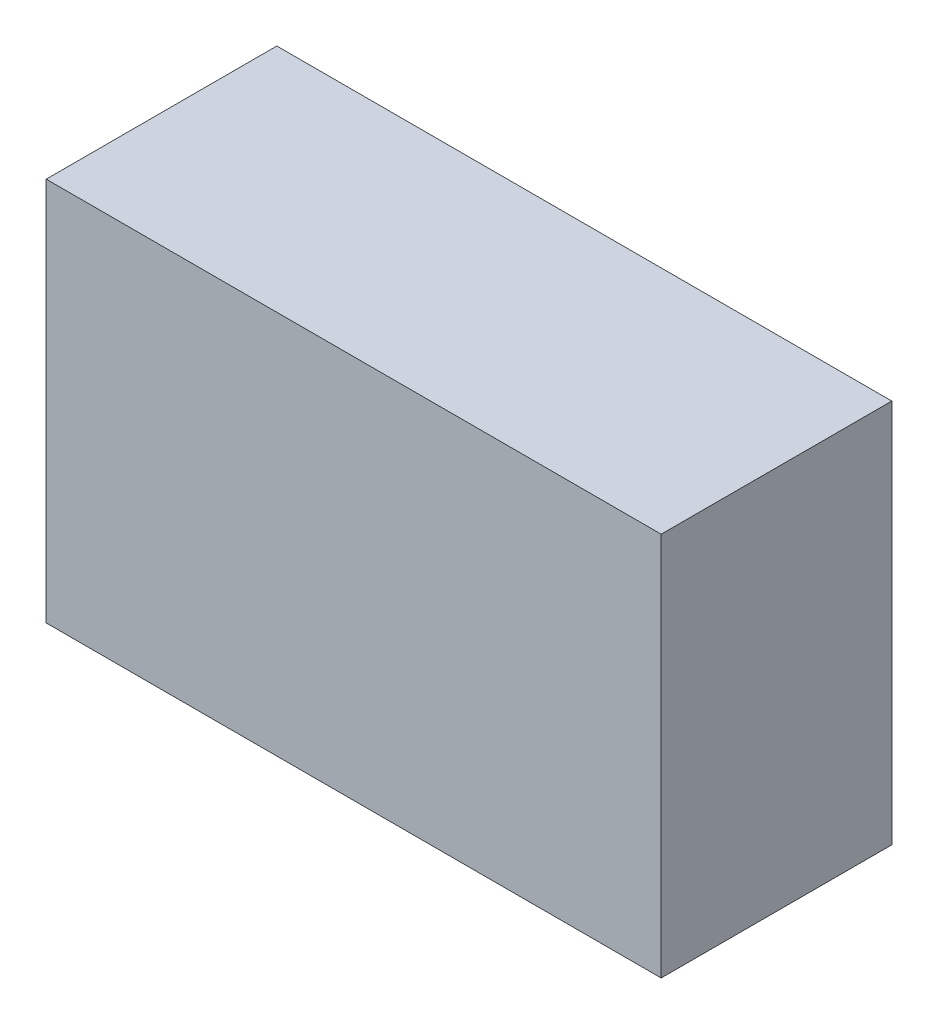
ISO-10303-21;
HEADER;
FILE_DESCRIPTION(('STEP AP214'),'2;1');
FILE_NAME('part.step','',(''),(''),'','','');
FILE_SCHEMA(('AUTOMOTIVE_DESIGN { 1 0 10303 214 1 1 1 1 }'));
ENDSEC;
DATA;
#1=APPLICATION_CONTEXT('core data for automotive mechanical design processes');
#2=APPLICATION_PROTOCOL_DEFINITION('international standard','automotive_design',2000,#1);
#3=PRODUCT_CONTEXT('',#1,'mechanical');
#4=PRODUCT('Part','Part','',(#3));
#5=PRODUCT_RELATED_PRODUCT_CATEGORY('part','',(#4));
#6=PRODUCT_DEFINITION_FORMATION('','',#4);
#7=PRODUCT_DEFINITION_CONTEXT('part definition',#1,'design');
#8=PRODUCT_DEFINITION('design','',#6,#7);
#9=PRODUCT_DEFINITION_SHAPE('','',#8);
#10=(LENGTH_UNIT() NAMED_UNIT(*) SI_UNIT(.MILLI.,.METRE.));
#11=(NAMED_UNIT(*) PLANE_ANGLE_UNIT() SI_UNIT($,.RADIAN.));
#12=(NAMED_UNIT(*) SI_UNIT($,.STERADIAN.) SOLID_ANGLE_UNIT());
#13=UNCERTAINTY_MEASURE_WITH_UNIT(LENGTH_MEASURE(1.E-05),#10,'distance_accuracy_value','');
#14=(GEOMETRIC_REPRESENTATION_CONTEXT(3) GLOBAL_UNCERTAINTY_ASSIGNED_CONTEXT((#13)) GLOBAL_UNIT_ASSIGNED_CONTEXT((#10,
#11,#12)) REPRESENTATION_CONTEXT('',''));
#15=CARTESIAN_POINT('',(0.,0.,0.));
#16=DIRECTION('',(0.,0.,1.));
#17=DIRECTION('',(1.,0.,0.));
#18=AXIS2_PLACEMENT_3D('',#15,#16,#17);
#19=CARTESIAN_POINT('',(-8.,5.,3.));
#20=DIRECTION('',(0.,-1.,0.));
#21=DIRECTION('',(0.,0.,-1.));
#22=AXIS2_PLACEMENT_3D('',#19,#20,#21);
#23=PLANE('',#22);
#24=DIRECTION('',(-1.,0.,0.));
#25=VECTOR('',#24,1.);
#26=CARTESIAN_POINT('',(-8.,5.,-3.));
#27=LINE('',#26,#25);
#28=CARTESIAN_POINT('',(8.,5.,-3.));
#29=VERTEX_POINT('',#28);
#30=CARTESIAN_POINT('',(-8.,5.,-3.));
#31=VERTEX_POINT('',#30);
#32=EDGE_CURVE('E100',#29,#31,#27,.T.);
#33=ORIENTED_EDGE('',*,*,#32,.T.);
#34=DIRECTION('',(0.,0.,-1.));
#35=VECTOR('',#34,1.);
#36=CARTESIAN_POINT('',(-8.,5.,3.));
#37=LINE('',#36,#35);
#38=CARTESIAN_POINT('',(-8.,5.,3.));
#39=VERTEX_POINT('',#38);
#40=EDGE_CURVE('E12',#39,#31,#37,.T.);
#41=ORIENTED_EDGE('',*,*,#40,.F.);
#42=DIRECTION('',(-1.,0.,0.));
#43=VECTOR('',#42,1.);
#44=CARTESIAN_POINT('',(-8.,5.,3.));
#45=LINE('',#44,#43);
#46=CARTESIAN_POINT('',(8.,5.,3.));
#47=VERTEX_POINT('',#46);
#48=EDGE_CURVE('E88',#47,#39,#45,.T.);
#49=ORIENTED_EDGE('',*,*,#48,.F.);
#50=DIRECTION('',(0.,0.,-1.));
#51=VECTOR('',#50,1.);
#52=CARTESIAN_POINT('',(8.,5.,3.));
#53=LINE('',#52,#51);
#54=EDGE_CURVE('E96',#47,#29,#53,.T.);
#55=ORIENTED_EDGE('',*,*,#54,.T.);
#56=EDGE_LOOP('',(#33,#41,#49,#55));
#57=FACE_BOUND('',#56,.T.);
#58=ADVANCED_FACE('F37',(#57),#23,.F.);
#59=CARTESIAN_POINT('',(-8.,-5.,3.));
#60=DIRECTION('',(1.,0.,0.));
#61=DIRECTION('',(0.,0.,-1.));
#62=AXIS2_PLACEMENT_3D('',#59,#60,#61);
#63=PLANE('',#62);
#64=DIRECTION('',(0.,-1.,0.));
#65=VECTOR('',#64,1.);
#66=CARTESIAN_POINT('',(-8.,-5.,-3.));
#67=LINE('',#66,#65);
#68=CARTESIAN_POINT('',(-8.,-5.,-3.));
#69=VERTEX_POINT('',#68);
#70=EDGE_CURVE('E92',#31,#69,#67,.T.);
#71=ORIENTED_EDGE('',*,*,#70,.T.);
#72=DIRECTION('',(0.,0.,-1.));
#73=VECTOR('',#72,1.);
#74=CARTESIAN_POINT('',(-8.,-5.,3.));
#75=LINE('',#74,#73);
#76=CARTESIAN_POINT('',(-8.,-5.,3.));
#77=VERTEX_POINT('',#76);
#78=EDGE_CURVE('E45',#77,#69,#75,.T.);
#79=ORIENTED_EDGE('',*,*,#78,.F.);
#80=DIRECTION('',(0.,-1.,0.));
#81=VECTOR('',#80,1.);
#82=CARTESIAN_POINT('',(-8.,-5.,3.));
#83=LINE('',#82,#81);
#84=EDGE_CURVE('E83',#39,#77,#83,.T.);
#85=ORIENTED_EDGE('',*,*,#84,.F.);
#86=ORIENTED_EDGE('',*,*,#40,.T.);
#87=EDGE_LOOP('',(#71,#79,#85,#86));
#88=FACE_BOUND('',#87,.T.);
#89=ADVANCED_FACE('F91',(#88),#63,.F.);
#90=CARTESIAN_POINT('',(-8.,-5.,3.));
#91=DIRECTION('',(0.,1.,0.));
#92=DIRECTION('',(0.,0.,1.));
#93=AXIS2_PLACEMENT_3D('',#90,#91,#92);
#94=PLANE('',#93);
#95=CARTESIAN_POINT('',(0.,-5.,0.));
#96=DIRECTION('',(0.,-1.,0.));
#97=DIRECTION('',(0.,0.,-1.));
#98=AXIS2_PLACEMENT_3D('',#95,#96,#97);
#99=CIRCLE('',#98,2.);
#100=CARTESIAN_POINT('',(0.,-5.,-2.));
#101=VERTEX_POINT('',#100);
#102=EDGE_CURVE('E116',#101,#101,#99,.T.);
#103=ORIENTED_EDGE('',*,*,#102,.F.);
#104=EDGE_LOOP('',(#103));
#105=FACE_BOUND('',#104,.T.);
#106=DIRECTION('',(1.,0.,0.));
#107=VECTOR('',#106,1.);
#108=CARTESIAN_POINT('',(-8.,-5.,-3.));
#109=LINE('',#108,#107);
#110=CARTESIAN_POINT('',(8.,-5.,-3.));
#111=VERTEX_POINT('',#110);
#112=EDGE_CURVE('E70',#69,#111,#109,.T.);
#113=ORIENTED_EDGE('',*,*,#112,.T.);
#114=DIRECTION('',(0.,0.,-1.));
#115=VECTOR('',#114,1.);
#116=CARTESIAN_POINT('',(8.,-5.,3.));
#117=LINE('',#116,#115);
#118=CARTESIAN_POINT('',(8.,-5.,3.));
#119=VERTEX_POINT('',#118);
#120=EDGE_CURVE('E93',#119,#111,#117,.T.);
#121=ORIENTED_EDGE('',*,*,#120,.F.);
#122=DIRECTION('',(1.,0.,0.));
#123=VECTOR('',#122,1.);
#124=CARTESIAN_POINT('',(-8.,-5.,3.));
#125=LINE('',#124,#123);
#126=EDGE_CURVE('E86',#77,#119,#125,.T.);
#127=ORIENTED_EDGE('',*,*,#126,.F.);
#128=ORIENTED_EDGE('',*,*,#78,.T.);
#129=EDGE_LOOP('',(#113,#121,#127,#128));
#130=FACE_BOUND('',#129,.T.);
#131=ADVANCED_FACE('F94',(#105,#130),#94,.F.);
#132=CARTESIAN_POINT('',(8.,-5.,3.));
#133=DIRECTION('',(-1.,0.,0.));
#134=DIRECTION('',(0.,0.,1.));
#135=AXIS2_PLACEMENT_3D('',#132,#133,#134);
#136=PLANE('',#135);
#137=DIRECTION('',(0.,1.,0.));
#138=VECTOR('',#137,1.);
#139=CARTESIAN_POINT('',(8.,-5.,-3.));
#140=LINE('',#139,#138);
#141=EDGE_CURVE('E76',#111,#29,#140,.T.);
#142=ORIENTED_EDGE('',*,*,#141,.T.);
#143=ORIENTED_EDGE('',*,*,#54,.F.);
#144=DIRECTION('',(0.,1.,0.));
#145=VECTOR('',#144,1.);
#146=CARTESIAN_POINT('',(8.,-5.,3.));
#147=LINE('',#146,#145);
#148=EDGE_CURVE('E53',#119,#47,#147,.T.);
#149=ORIENTED_EDGE('',*,*,#148,.F.);
#150=ORIENTED_EDGE('',*,*,#120,.T.);
#151=EDGE_LOOP('',(#142,#143,#149,#150));
#152=FACE_BOUND('',#151,.T.);
#153=ADVANCED_FACE('F108',(#152),#136,.F.);
#154=CARTESIAN_POINT('',(0.,0.,3.));
#155=DIRECTION('',(0.,0.,1.));
#156=DIRECTION('',(1.,0.,0.));
#157=AXIS2_PLACEMENT_3D('',#154,#155,#156);
#158=PLANE('',#157);
#159=ORIENTED_EDGE('',*,*,#48,.T.);
#160=ORIENTED_EDGE('',*,*,#84,.T.);
#161=ORIENTED_EDGE('',*,*,#126,.T.);
#162=ORIENTED_EDGE('',*,*,#148,.T.);
#163=EDGE_LOOP('',(#159,#160,#161,#162));
#164=FACE_BOUND('',#163,.T.);
#165=ADVANCED_FACE('F84',(#164),#158,.T.);
#166=CARTESIAN_POINT('',(0.,0.,-3.));
#167=DIRECTION('',(0.,0.,1.));
#168=DIRECTION('',(1.,0.,0.));
#169=AXIS2_PLACEMENT_3D('',#166,#167,#168);
#170=PLANE('',#169);
#171=ORIENTED_EDGE('',*,*,#32,.F.);
#172=ORIENTED_EDGE('',*,*,#141,.F.);
#173=ORIENTED_EDGE('',*,*,#112,.F.);
#174=ORIENTED_EDGE('',*,*,#70,.F.);
#175=EDGE_LOOP('',(#171,#172,#173,#174));
#176=FACE_BOUND('',#175,.T.);
#177=ADVANCED_FACE('F111',(#176),#170,.F.);
#178=CARTESIAN_POINT('',(0.,10.6568542494924,0.));
#179=DIRECTION('',(0.,-1.,0.));
#180=DIRECTION('',(0.,0.,-1.));
#181=AXIS2_PLACEMENT_3D('',#178,#179,#180);
#182=CYLINDRICAL_SURFACE('',#181,2.);
#183=CARTESIAN_POINT('',(0.,0.,0.));
#184=DIRECTION('',(0.,-1.,0.));
#185=DIRECTION('',(0.,0.,-1.));
#186=AXIS2_PLACEMENT_3D('',#183,#184,#185);
#187=CIRCLE('',#186,2.);
#188=CARTESIAN_POINT('',(0.,0.,-2.));
#189=VERTEX_POINT('',#188);
#190=EDGE_CURVE('E103',#189,#189,#187,.F.);
#191=ORIENTED_EDGE('',*,*,#190,.T.);
#192=EDGE_LOOP('',(#191));
#193=FACE_BOUND('',#192,.T.);
#194=ORIENTED_EDGE('',*,*,#102,.T.);
#195=EDGE_LOOP('',(#194));
#196=FACE_BOUND('',#195,.T.);
#197=ADVANCED_FACE('F120',(#193,#196),#182,.F.);
#198=CARTESIAN_POINT('',(-8.,0.,3.));
#199=DIRECTION('',(0.,-1.,0.));
#200=DIRECTION('',(0.,0.,-1.));
#201=AXIS2_PLACEMENT_3D('',#198,#199,#200);
#202=PLANE('',#201);
#203=ORIENTED_EDGE('',*,*,#190,.F.);
#204=EDGE_LOOP('',(#203));
#205=FACE_BOUND('',#204,.T.);
#206=ADVANCED_FACE('F171',(#205),#202,.T.);
#207=CLOSED_SHELL('',(#58,#89,#131,#153,#165,#177,#197,#206));
#208=MANIFOLD_SOLID_BREP('B2',#207);
#209=ADVANCED_BREP_SHAPE_REPRESENTATION('',(#18,#208),#14);
#210=SHAPE_DEFINITION_REPRESENTATION(#9,#209);
ENDSEC;
END-ISO-10303-21;
